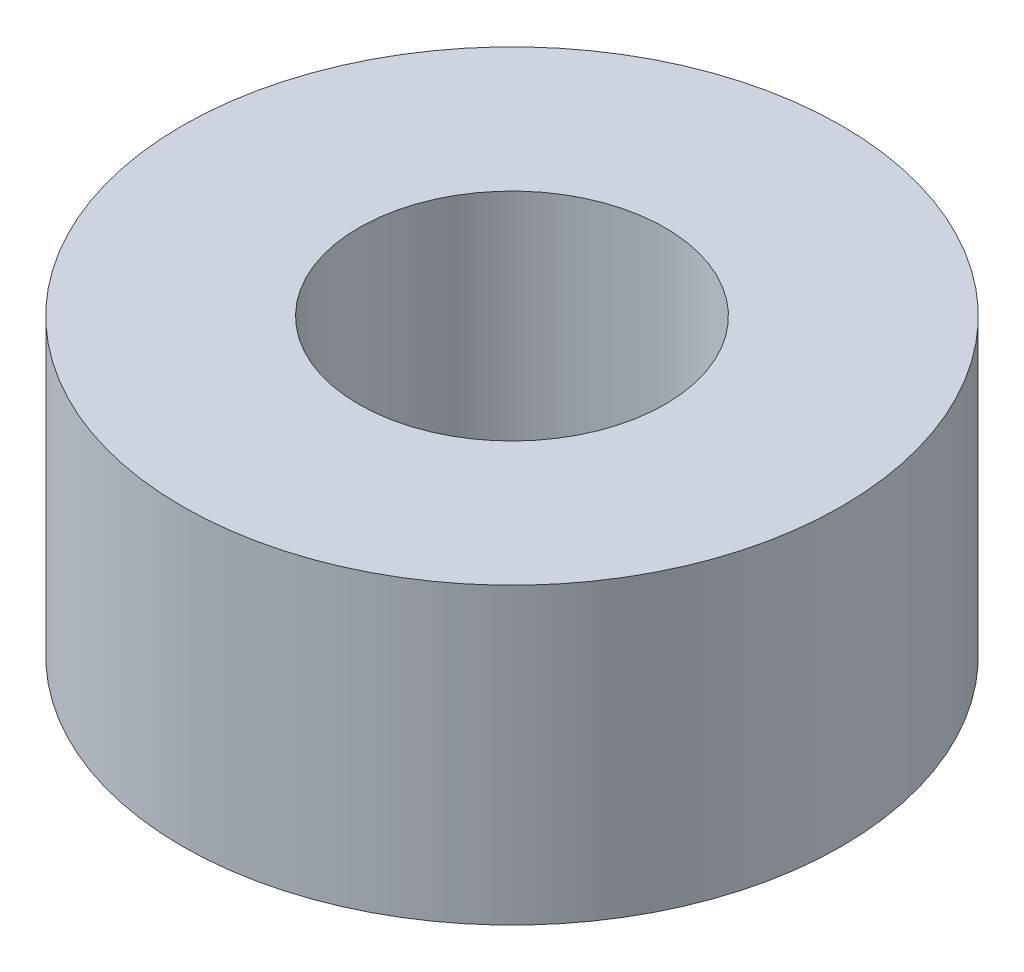
ISO-10303-21;
HEADER;
FILE_DESCRIPTION(('STEP AP214'),'2;1');
FILE_NAME('part.step','',(''),(''),'','','');
FILE_SCHEMA(('AUTOMOTIVE_DESIGN { 1 0 10303 214 1 1 1 1 }'));
ENDSEC;
DATA;
#1=APPLICATION_CONTEXT('core data for automotive mechanical design processes');
#2=APPLICATION_PROTOCOL_DEFINITION('international standard','automotive_design',2000,#1);
#3=PRODUCT_CONTEXT('',#1,'mechanical');
#4=PRODUCT('Part','Part','',(#3));
#5=PRODUCT_RELATED_PRODUCT_CATEGORY('part','',(#4));
#6=PRODUCT_DEFINITION_FORMATION('','',#4);
#7=PRODUCT_DEFINITION_CONTEXT('part definition',#1,'design');
#8=PRODUCT_DEFINITION('design','',#6,#7);
#9=PRODUCT_DEFINITION_SHAPE('','',#8);
#10=(LENGTH_UNIT() NAMED_UNIT(*) SI_UNIT(.MILLI.,.METRE.));
#11=(NAMED_UNIT(*) PLANE_ANGLE_UNIT() SI_UNIT($,.RADIAN.));
#12=(NAMED_UNIT(*) SI_UNIT($,.STERADIAN.) SOLID_ANGLE_UNIT());
#13=UNCERTAINTY_MEASURE_WITH_UNIT(LENGTH_MEASURE(1.E-05),#10,'distance_accuracy_value','');
#14=(GEOMETRIC_REPRESENTATION_CONTEXT(3) GLOBAL_UNCERTAINTY_ASSIGNED_CONTEXT((#13)) GLOBAL_UNIT_ASSIGNED_CONTEXT((#10,
#11,#12)) REPRESENTATION_CONTEXT('',''));
#15=CARTESIAN_POINT('',(0.,0.,0.));
#16=DIRECTION('',(0.,0.,1.));
#17=DIRECTION('',(1.,0.,0.));
#18=AXIS2_PLACEMENT_3D('',#15,#16,#17);
#19=CARTESIAN_POINT('',(0.,5.,0.));
#20=DIRECTION('',(0.,1.,0.));
#21=DIRECTION('',(0.,0.,1.));
#22=AXIS2_PLACEMENT_3D('',#19,#20,#21);
#23=PLANE('',#22);
#24=CARTESIAN_POINT('',(0.,5.,0.));
#25=DIRECTION('',(0.,1.,0.));
#26=DIRECTION('',(0.,0.,1.));
#27=AXIS2_PLACEMENT_3D('',#24,#25,#26);
#28=CIRCLE('',#27,5.6);
#29=CARTESIAN_POINT('',(0.,5.,5.6));
#30=VERTEX_POINT('',#29);
#31=EDGE_CURVE('E10',#30,#30,#28,.T.);
#32=ORIENTED_EDGE('',*,*,#31,.T.);
#33=EDGE_LOOP('',(#32));
#34=FACE_BOUND('',#33,.T.);
#35=CARTESIAN_POINT('',(0.,5.,0.));
#36=DIRECTION('',(0.,1.,0.));
#37=DIRECTION('',(0.,0.,1.));
#38=AXIS2_PLACEMENT_3D('',#35,#36,#37);
#39=CIRCLE('',#38,2.6);
#40=CARTESIAN_POINT('',(0.,5.,2.6));
#41=VERTEX_POINT('',#40);
#42=EDGE_CURVE('E56',#41,#41,#39,.T.);
#43=ORIENTED_EDGE('',*,*,#42,.F.);
#44=EDGE_LOOP('',(#43));
#45=FACE_BOUND('',#44,.T.);
#46=ADVANCED_FACE('F43',(#34,#45),#23,.T.);
#47=CARTESIAN_POINT('',(0.,0.,0.));
#48=DIRECTION('',(0.,1.,0.));
#49=DIRECTION('',(0.,0.,1.));
#50=AXIS2_PLACEMENT_3D('',#47,#48,#49);
#51=PLANE('',#50);
#52=CARTESIAN_POINT('',(0.,0.,0.));
#53=DIRECTION('',(0.,1.,0.));
#54=DIRECTION('',(0.,0.,1.));
#55=AXIS2_PLACEMENT_3D('',#52,#53,#54);
#56=CIRCLE('',#55,5.6);
#57=CARTESIAN_POINT('',(0.,0.,5.6));
#58=VERTEX_POINT('',#57);
#59=EDGE_CURVE('E47',#58,#58,#56,.T.);
#60=ORIENTED_EDGE('',*,*,#59,.F.);
#61=EDGE_LOOP('',(#60));
#62=FACE_BOUND('',#61,.T.);
#63=CARTESIAN_POINT('',(0.,0.,0.));
#64=DIRECTION('',(0.,1.,0.));
#65=DIRECTION('',(0.,0.,1.));
#66=AXIS2_PLACEMENT_3D('',#63,#64,#65);
#67=CIRCLE('',#66,2.6);
#68=CARTESIAN_POINT('',(0.,0.,2.6));
#69=VERTEX_POINT('',#68);
#70=EDGE_CURVE('E58',#69,#69,#67,.T.);
#71=ORIENTED_EDGE('',*,*,#70,.T.);
#72=EDGE_LOOP('',(#71));
#73=FACE_BOUND('',#72,.T.);
#74=ADVANCED_FACE('F70',(#62,#73),#51,.F.);
#75=CARTESIAN_POINT('',(0.,5.,0.));
#76=DIRECTION('',(0.,-1.,0.));
#77=DIRECTION('',(0.,0.,-1.));
#78=AXIS2_PLACEMENT_3D('',#75,#76,#77);
#79=CYLINDRICAL_SURFACE('',#78,5.6);
#80=ORIENTED_EDGE('',*,*,#31,.F.);
#81=EDGE_LOOP('',(#80));
#82=FACE_BOUND('',#81,.T.);
#83=ORIENTED_EDGE('',*,*,#59,.T.);
#84=EDGE_LOOP('',(#83));
#85=FACE_BOUND('',#84,.T.);
#86=ADVANCED_FACE('F45',(#82,#85),#79,.T.);
#87=CARTESIAN_POINT('',(0.,5.,0.));
#88=DIRECTION('',(0.,-1.,0.));
#89=DIRECTION('',(0.,0.,-1.));
#90=AXIS2_PLACEMENT_3D('',#87,#88,#89);
#91=CYLINDRICAL_SURFACE('',#90,2.6);
#92=ORIENTED_EDGE('',*,*,#42,.T.);
#93=EDGE_LOOP('',(#92));
#94=FACE_BOUND('',#93,.T.);
#95=ORIENTED_EDGE('',*,*,#70,.F.);
#96=EDGE_LOOP('',(#95));
#97=FACE_BOUND('',#96,.T.);
#98=ADVANCED_FACE('F66',(#94,#97),#91,.F.);
#99=CLOSED_SHELL('',(#46,#74,#86,#98));
#100=MANIFOLD_SOLID_BREP('B2',#99);
#101=ADVANCED_BREP_SHAPE_REPRESENTATION('',(#18,#100),#14);
#102=SHAPE_DEFINITION_REPRESENTATION(#9,#101);
ENDSEC;
END-ISO-10303-21;
